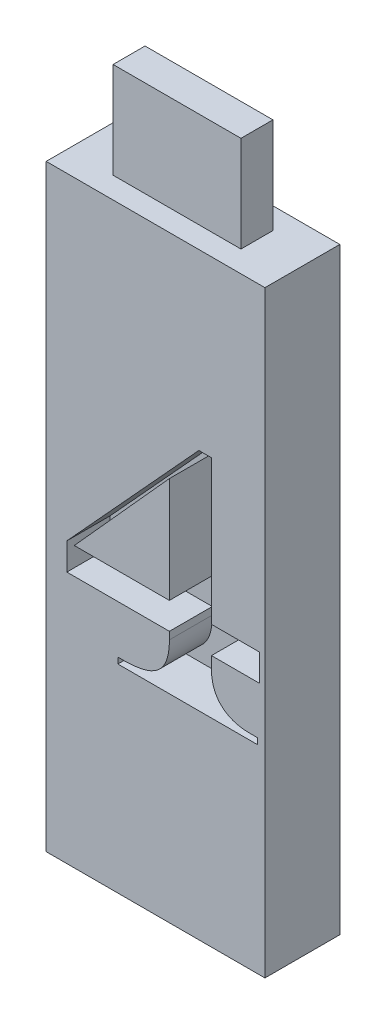
ISO-10303-21;
HEADER;
FILE_DESCRIPTION(('STEP AP214'),'2;1');
FILE_NAME('part.step','',(''),(''),'','','');
FILE_SCHEMA(('AUTOMOTIVE_DESIGN { 1 0 10303 214 1 1 1 1 }'));
ENDSEC;
DATA;
#1=APPLICATION_CONTEXT('core data for automotive mechanical design processes');
#2=APPLICATION_PROTOCOL_DEFINITION('international standard','automotive_design',2000,#1);
#3=PRODUCT_CONTEXT('',#1,'mechanical');
#4=PRODUCT('Part','Part','',(#3));
#5=PRODUCT_RELATED_PRODUCT_CATEGORY('part','',(#4));
#6=PRODUCT_DEFINITION_FORMATION('','',#4);
#7=PRODUCT_DEFINITION_CONTEXT('part definition',#1,'design');
#8=PRODUCT_DEFINITION('design','',#6,#7);
#9=PRODUCT_DEFINITION_SHAPE('','',#8);
#10=(LENGTH_UNIT() NAMED_UNIT(*) SI_UNIT(.MILLI.,.METRE.));
#11=(NAMED_UNIT(*) PLANE_ANGLE_UNIT() SI_UNIT($,.RADIAN.));
#12=(NAMED_UNIT(*) SI_UNIT($,.STERADIAN.) SOLID_ANGLE_UNIT());
#13=UNCERTAINTY_MEASURE_WITH_UNIT(LENGTH_MEASURE(1.E-05),#10,'distance_accuracy_value','');
#14=(GEOMETRIC_REPRESENTATION_CONTEXT(3) GLOBAL_UNCERTAINTY_ASSIGNED_CONTEXT((#13)) GLOBAL_UNIT_ASSIGNED_CONTEXT((#10,
#11,#12)) REPRESENTATION_CONTEXT('',''));
#15=CARTESIAN_POINT('',(0.,0.,0.));
#16=DIRECTION('',(0.,0.,1.));
#17=DIRECTION('',(1.,0.,0.));
#18=AXIS2_PLACEMENT_3D('',#15,#16,#17);
#19=CARTESIAN_POINT('',(-8.69,23.749,5.95));
#20=DIRECTION('',(0.,-1.,0.));
#21=DIRECTION('',(0.,0.,-1.));
#22=AXIS2_PLACEMENT_3D('',#19,#20,#21);
#23=PLANE('',#22);
#24=DIRECTION('',(-1.,0.,0.));
#25=VECTOR('',#24,1.);
#26=CARTESIAN_POINT('',(-8.69,23.749,0.));
#27=LINE('',#26,#25);
#28=CARTESIAN_POINT('',(8.69,23.749,0.));
#29=VERTEX_POINT('',#28);
#30=CARTESIAN_POINT('',(-8.69,23.749,0.));
#31=VERTEX_POINT('',#30);
#32=EDGE_CURVE('E380',#29,#31,#27,.T.);
#33=ORIENTED_EDGE('',*,*,#32,.T.);
#34=DIRECTION('',(0.,0.,-1.));
#35=VECTOR('',#34,1.);
#36=CARTESIAN_POINT('',(-8.69,23.749,5.95));
#37=LINE('',#36,#35);
#38=CARTESIAN_POINT('',(-8.69,23.749,5.95));
#39=VERTEX_POINT('',#38);
#40=EDGE_CURVE('E48',#39,#31,#37,.T.);
#41=ORIENTED_EDGE('',*,*,#40,.F.);
#42=DIRECTION('',(-1.,0.,0.));
#43=VECTOR('',#42,1.);
#44=CARTESIAN_POINT('',(-8.69,23.749,5.95));
#45=LINE('',#44,#43);
#46=CARTESIAN_POINT('',(8.69,23.749,5.95));
#47=VERTEX_POINT('',#46);
#48=EDGE_CURVE('E418',#47,#39,#45,.T.);
#49=ORIENTED_EDGE('',*,*,#48,.F.);
#50=DIRECTION('',(0.,0.,-1.));
#51=VECTOR('',#50,1.);
#52=CARTESIAN_POINT('',(8.69,23.749,5.95));
#53=LINE('',#52,#51);
#54=EDGE_CURVE('E11',#47,#29,#53,.T.);
#55=ORIENTED_EDGE('',*,*,#54,.T.);
#56=EDGE_LOOP('',(#33,#41,#49,#55));
#57=FACE_BOUND('',#56,.T.);
#58=DIRECTION('',(0.,0.,-1.));
#59=VECTOR('',#58,1.);
#60=CARTESIAN_POINT('',(5.08,23.749,4.245));
#61=LINE('',#60,#59);
#62=CARTESIAN_POINT('',(5.08,23.749,4.245));
#63=VERTEX_POINT('',#62);
#64=CARTESIAN_POINT('',(5.08,23.749,1.705));
#65=VERTEX_POINT('',#64);
#66=EDGE_CURVE('E55',#63,#65,#61,.T.);
#67=ORIENTED_EDGE('',*,*,#66,.F.);
#68=DIRECTION('',(1.,0.,0.));
#69=VECTOR('',#68,1.);
#70=CARTESIAN_POINT('',(-5.08,23.749,4.245));
#71=LINE('',#70,#69);
#72=CARTESIAN_POINT('',(-5.08,23.749,4.245));
#73=VERTEX_POINT('',#72);
#74=EDGE_CURVE('E59',#73,#63,#71,.T.);
#75=ORIENTED_EDGE('',*,*,#74,.F.);
#76=DIRECTION('',(0.,0.,1.));
#77=VECTOR('',#76,1.);
#78=CARTESIAN_POINT('',(-5.08,23.749,4.245));
#79=LINE('',#78,#77);
#80=CARTESIAN_POINT('',(-5.08,23.749,1.705));
#81=VERTEX_POINT('',#80);
#82=EDGE_CURVE('E907',#81,#73,#79,.T.);
#83=ORIENTED_EDGE('',*,*,#82,.F.);
#84=DIRECTION('',(-1.,0.,0.));
#85=VECTOR('',#84,1.);
#86=CARTESIAN_POINT('',(-5.08,23.749,1.705));
#87=LINE('',#86,#85);
#88=EDGE_CURVE('E917',#65,#81,#87,.T.);
#89=ORIENTED_EDGE('',*,*,#88,.F.);
#90=EDGE_LOOP('',(#67,#75,#83,#89));
#91=FACE_BOUND('',#90,.T.);
#92=ADVANCED_FACE('F39',(#57,#91),#23,.F.);
#93=CARTESIAN_POINT('',(0.,0.,5.95));
#94=DIRECTION('',(0.,0.,-1.));
#95=DIRECTION('',(-1.,0.,0.));
#96=AXIS2_PLACEMENT_3D('',#93,#94,#95);
#97=PLANE('',#96);
#98=DIRECTION('',(0.,1.,0.));
#99=VECTOR('',#98,1.);
#100=CARTESIAN_POINT('',(8.69,-23.749,5.95));
#101=LINE('',#100,#99);
#102=CARTESIAN_POINT('',(8.69,-23.749,5.95));
#103=VERTEX_POINT('',#102);
#104=EDGE_CURVE('E401',#103,#47,#101,.T.);
#105=ORIENTED_EDGE('',*,*,#104,.T.);
#106=ORIENTED_EDGE('',*,*,#48,.T.);
#107=DIRECTION('',(0.,-1.,0.));
#108=VECTOR('',#107,1.);
#109=CARTESIAN_POINT('',(-8.69,-23.749,5.95));
#110=LINE('',#109,#108);
#111=CARTESIAN_POINT('',(-8.69,-23.749,5.95));
#112=VERTEX_POINT('',#111);
#113=EDGE_CURVE('E393',#39,#112,#110,.T.);
#114=ORIENTED_EDGE('',*,*,#113,.T.);
#115=DIRECTION('',(1.,0.,0.));
#116=VECTOR('',#115,1.);
#117=CARTESIAN_POINT('',(-8.69,-23.749,5.95));
#118=LINE('',#117,#116);
#119=EDGE_CURVE('E409',#112,#103,#118,.T.);
#120=ORIENTED_EDGE('',*,*,#119,.T.);
#121=EDGE_LOOP('',(#105,#106,#114,#120));
#122=FACE_BOUND('',#121,.T.);
#123=DIRECTION('',(0.674941128782271,0.73787158278261,0.));
#124=VECTOR('',#123,1.);
#125=CARTESIAN_POINT('',(-7.04744218431016,-1.5393328511895,5.95));
#126=LINE('',#125,#124);
#127=CARTESIAN_POINT('',(-7.04744218431016,-1.5393328511895,5.95));
#128=VERTEX_POINT('',#127);
#129=CARTESIAN_POINT('',(3.43863994426617,9.92445515556726,5.95));
#130=VERTEX_POINT('',#129);
#131=EDGE_CURVE('E282',#128,#130,#126,.T.);
#132=ORIENTED_EDGE('',*,*,#131,.T.);
#133=DIRECTION('',(1.,0.,0.));
#134=VECTOR('',#133,1.);
#135=CARTESIAN_POINT('',(3.43863994426617,9.92445515556726,5.95));
#136=LINE('',#135,#134);
#137=CARTESIAN_POINT('',(4.44246773522241,9.92445515556726,5.95));
#138=VERTEX_POINT('',#137);
#139=EDGE_CURVE('E731',#130,#138,#136,.T.);
#140=ORIENTED_EDGE('',*,*,#139,.T.);
#141=DIRECTION('',(0.,-1.,0.));
#142=VECTOR('',#141,1.);
#143=CARTESIAN_POINT('',(4.44246773522241,9.92445515556726,5.95));
#144=LINE('',#143,#142);
#145=CARTESIAN_POINT('',(4.44246773522241,-1.5393328511895,5.95));
#146=VERTEX_POINT('',#145);
#147=EDGE_CURVE('E735',#138,#146,#144,.T.);
#148=ORIENTED_EDGE('',*,*,#147,.T.);
#149=DIRECTION('',(1.,0.,0.));
#150=VECTOR('',#149,1.);
#151=CARTESIAN_POINT('',(4.44246773522241,-1.5393328511895,5.95));
#152=LINE('',#151,#150);
#153=CARTESIAN_POINT('',(8.2562670004911,-1.5393328511895,5.95));
#154=VERTEX_POINT('',#153);
#155=EDGE_CURVE('E739',#146,#154,#152,.T.);
#156=ORIENTED_EDGE('',*,*,#155,.T.);
#157=DIRECTION('',(0.,-1.,0.));
#158=VECTOR('',#157,1.);
#159=CARTESIAN_POINT('',(8.2562670004911,-1.5393328511895,5.95));
#160=LINE('',#159,#158);
#161=CARTESIAN_POINT('',(8.2562670004911,-3.68879310245639,5.95));
#162=VERTEX_POINT('',#161);
#163=EDGE_CURVE('E743',#154,#162,#160,.T.);
#164=ORIENTED_EDGE('',*,*,#163,.T.);
#165=DIRECTION('',(-1.,0.,0.));
#166=VECTOR('',#165,1.);
#167=CARTESIAN_POINT('',(8.2562670004911,-3.68879310245639,5.95));
#168=LINE('',#167,#166);
#169=CARTESIAN_POINT('',(4.44246773522241,-3.68879310245639,5.95));
#170=VERTEX_POINT('',#169);
#171=EDGE_CURVE('E747',#162,#170,#168,.T.);
#172=ORIENTED_EDGE('',*,*,#171,.T.);
#173=DIRECTION('',(0.,-1.,0.));
#174=VECTOR('',#173,1.);
#175=CARTESIAN_POINT('',(4.44246773522241,-3.68879310245639,5.95));
#176=LINE('',#175,#174);
#177=CARTESIAN_POINT('',(4.44246773522241,-4.64037706786101,5.95));
#178=VERTEX_POINT('',#177);
#179=EDGE_CURVE('E751',#170,#178,#176,.T.);
#180=ORIENTED_EDGE('',*,*,#179,.T.);
#181=CARTESIAN_POINT('',(4.44246773522241,-4.64037706786101,5.95));
#182=CARTESIAN_POINT('',(4.44366975110086,-4.75127379866785,5.95));
#183=CARTESIAN_POINT('',(4.44601529045328,-4.96767081207351,5.95));
#184=CARTESIAN_POINT('',(4.49157384869356,-5.28006772864918,5.95));
#185=CARTESIAN_POINT('',(4.54742857293339,-5.57645144328253,5.95));
#186=CARTESIAN_POINT('',(4.63867937536125,-5.85058081596039,5.95));
#187=CARTESIAN_POINT('',(4.75028432598673,-6.10998885158692,5.95));
#188=CARTESIAN_POINT('',(4.89304534944383,-6.34555952869846,5.95));
#189=CARTESIAN_POINT('',(5.05424378576291,-6.56764848995591,5.95));
#190=CARTESIAN_POINT('',(5.24539935969311,-6.76411469066924,5.95));
#191=CARTESIAN_POINT('',(5.45895144040017,-6.93928061212406,5.95));
#192=CARTESIAN_POINT('',(5.69043798794372,-7.09416619456643,5.95));
#193=CARTESIAN_POINT('',(5.94412250974168,-7.21948208954657,5.95));
#194=CARTESIAN_POINT('',(6.21333093360488,-7.33042139895678,5.95));
#195=CARTESIAN_POINT('',(6.50533129087422,-7.41164301302733,5.95));
#196=CARTESIAN_POINT('',(6.81689616278627,-7.46473149438171,5.95));
#197=CARTESIAN_POINT('',(7.14565774333197,-7.50542750898047,5.95));
#198=CARTESIAN_POINT('',(7.37171724603748,-7.50848784223009,5.95));
#199=CARTESIAN_POINT('',(7.48753642451717,-7.51005577137531,5.95));
#200=B_SPLINE_CURVE_WITH_KNOTS('',3,(#181,#182,#183,#184,#185,#186,#187,#188,#189,#190,#191,
#192,#193,#194,#195,#196,#197,#198,#199),.UNSPECIFIED.,.F.,.F.,(4,1,1,1,1,1,1,1,1,1,1,1,1,1,1,1,
4),(0.,0.0699170360090995,0.136431774575017,0.198947754675914,0.26002731117954,
0.318381663113538,0.376820464226212,0.43350835233674,0.491257429411246,0.549262128880397,
0.607621762468199,0.666611761420359,0.727554917437324,0.791185073348929,0.857407233884197,
0.926944115018277,1.),.UNSPECIFIED.);
#201=CARTESIAN_POINT('',(7.48753642451717,-7.51005577137531,5.95));
#202=VERTEX_POINT('',#201);
#203=EDGE_CURVE('E755',#178,#202,#200,.T.);
#204=ORIENTED_EDGE('',*,*,#203,.T.);
#205=DIRECTION('',(1.,0.,0.));
#206=VECTOR('',#205,1.);
#207=CARTESIAN_POINT('',(7.48753642451717,-7.51005577137531,5.95));
#208=LINE('',#207,#206);
#209=CARTESIAN_POINT('',(8.08087701471064,-7.51005577137531,5.95));
#210=VERTEX_POINT('',#209);
#211=EDGE_CURVE('E761',#202,#210,#208,.T.);
#212=ORIENTED_EDGE('',*,*,#211,.T.);
#213=DIRECTION('',(0.,-1.,0.));
#214=VECTOR('',#213,1.);
#215=CARTESIAN_POINT('',(8.08087701471064,-7.51005577137531,5.95));
#216=LINE('',#215,#214);
#217=CARTESIAN_POINT('',(8.08087701471064,-7.98771360499018,5.95));
#218=VERTEX_POINT('',#217);
#219=EDGE_CURVE('E768',#210,#218,#216,.T.);
#220=ORIENTED_EDGE('',*,*,#219,.T.);
#221=DIRECTION('',(-1.,0.,0.));
#222=VECTOR('',#221,1.);
#223=CARTESIAN_POINT('',(8.08087701471064,-7.98771360499018,5.95));
#224=LINE('',#223,#222);
#225=CARTESIAN_POINT('',(-2.99481400223404,-7.98771360499018,5.95));
#226=VERTEX_POINT('',#225);
#227=EDGE_CURVE('E772',#218,#226,#224,.T.);
#228=ORIENTED_EDGE('',*,*,#227,.T.);
#229=DIRECTION('',(0.,1.,0.));
#230=VECTOR('',#229,1.);
#231=CARTESIAN_POINT('',(-2.99481400223404,-7.98771360499018,5.95));
#232=LINE('',#231,#230);
#233=CARTESIAN_POINT('',(-2.99481400223404,-7.51005577137531,5.95));
#234=VERTEX_POINT('',#233);
#235=EDGE_CURVE('E776',#226,#234,#232,.T.);
#236=ORIENTED_EDGE('',*,*,#235,.T.);
#237=DIRECTION('',(1.,0.,0.));
#238=VECTOR('',#237,1.);
#239=CARTESIAN_POINT('',(-2.99481400223404,-7.51005577137531,5.95));
#240=LINE('',#239,#238);
#241=CARTESIAN_POINT('',(-2.4537172375922,-7.51005577137531,5.95));
#242=VERTEX_POINT('',#241);
#243=EDGE_CURVE('E780',#234,#242,#240,.T.);
#244=ORIENTED_EDGE('',*,*,#243,.T.);
#245=CARTESIAN_POINT('',(-2.4537172375922,-7.51005577137531,5.95));
#246=CARTESIAN_POINT('',(-2.25823867435052,-7.50591168057794,5.95));
#247=CARTESIAN_POINT('',(-1.88482523440783,-7.49799542022477,5.95));
#248=CARTESIAN_POINT('',(-1.35131896545283,-7.43442233785716,5.95));
#249=CARTESIAN_POINT('',(-0.871964816685648,-7.3319439381712,5.95));
#250=CARTESIAN_POINT('',(-0.442786010743591,-7.18885028997265,5.95));
#251=CARTESIAN_POINT('',(-0.0689533016064384,-6.99156968457036,5.95));
#252=CARTESIAN_POINT('',(0.256975704342163,-6.75450130739875,5.95));
#253=CARTESIAN_POINT('',(0.523821338195153,-6.46213265309357,5.95));
#254=CARTESIAN_POINT('',(0.738539375180858,-6.12479811403825,5.95));
#255=CARTESIAN_POINT('',(0.904653386000662,-5.73672840445958,5.95));
#256=CARTESIAN_POINT('',(1.01620095687366,-5.29606749085615,5.95));
#257=CARTESIAN_POINT('',(1.08879249014675,-4.80448241414839,5.95));
#258=CARTESIAN_POINT('',(1.0954047982199,-4.45905398480305,5.95));
#259=CARTESIAN_POINT('',(1.09886289991836,-4.27840199082474,5.95));
#260=B_SPLINE_CURVE_WITH_KNOTS('',3,(#245,#246,#247,#248,#249,#250,#251,#252,#253,#254,#255,
#256,#257,#258,#259),.UNSPECIFIED.,.F.,.F.,(4,1,1,1,1,1,1,1,1,1,1,1,4),(0.,0.105562726738923,
0.201651476599896,0.289686176127068,0.37000366991305,0.445137561177256,0.517163983412064,
0.586586174477866,0.65759635562237,0.732232915493405,0.81355581343149,0.902493508906899,1.),.UNSPECIFIED.);
#261=CARTESIAN_POINT('',(1.09886289991836,-4.27840199082474,5.95));
#262=VERTEX_POINT('',#261);
#263=EDGE_CURVE('E784',#242,#262,#260,.T.);
#264=ORIENTED_EDGE('',*,*,#263,.T.);
#265=DIRECTION('',(0.,1.,0.));
#266=VECTOR('',#265,1.);
#267=CARTESIAN_POINT('',(1.09886289991836,-4.27840199082474,5.95));
#268=LINE('',#267,#266);
#269=CARTESIAN_POINT('',(1.09886289991836,-3.68879310245639,5.95));
#270=VERTEX_POINT('',#269);
#271=EDGE_CURVE('E790',#262,#270,#268,.T.);
#272=ORIENTED_EDGE('',*,*,#271,.T.);
#273=DIRECTION('',(-1.,0.,0.));
#274=VECTOR('',#273,1.);
#275=CARTESIAN_POINT('',(1.09886289991836,-3.68879310245639,5.95));
#276=LINE('',#275,#274);
#277=CARTESIAN_POINT('',(-7.04744218431016,-3.68879310245639,5.95));
#278=VERTEX_POINT('',#277);
#279=EDGE_CURVE('E797',#270,#278,#276,.T.);
#280=ORIENTED_EDGE('',*,*,#279,.T.);
#281=DIRECTION('',(0.,1.,0.));
#282=VECTOR('',#281,1.);
#283=CARTESIAN_POINT('',(-7.04744218431016,-3.68879310245639,5.95));
#284=LINE('',#283,#282);
#285=EDGE_CURVE('E294',#278,#128,#284,.T.);
#286=ORIENTED_EDGE('',*,*,#285,.T.);
#287=EDGE_LOOP('',(#132,#140,#148,#156,#164,#172,#180,#204,#212,#220,#228,#236,#244,#264,#272,
#280,#286));
#288=FACE_BOUND('',#287,.T.);
#289=ADVANCED_FACE('F360',(#122,#288),#97,.F.);
#290=CARTESIAN_POINT('',(8.69,-23.749,5.95));
#291=DIRECTION('',(-1.,0.,0.));
#292=DIRECTION('',(0.,0.,1.));
#293=AXIS2_PLACEMENT_3D('',#290,#291,#292);
#294=PLANE('',#293);
#295=DIRECTION('',(0.,1.,0.));
#296=VECTOR('',#295,1.);
#297=CARTESIAN_POINT('',(8.69,-23.749,0.));
#298=LINE('',#297,#296);
#299=CARTESIAN_POINT('',(8.69,-23.749,0.));
#300=VERTEX_POINT('',#299);
#301=EDGE_CURVE('E389',#300,#29,#298,.T.);
#302=ORIENTED_EDGE('',*,*,#301,.T.);
#303=ORIENTED_EDGE('',*,*,#54,.F.);
#304=ORIENTED_EDGE('',*,*,#104,.F.);
#305=DIRECTION('',(0.,0.,-1.));
#306=VECTOR('',#305,1.);
#307=CARTESIAN_POINT('',(8.69,-23.749,5.95));
#308=LINE('',#307,#306);
#309=EDGE_CURVE('E405',#103,#300,#308,.T.);
#310=ORIENTED_EDGE('',*,*,#309,.T.);
#311=EDGE_LOOP('',(#302,#303,#304,#310));
#312=FACE_BOUND('',#311,.T.);
#313=ADVANCED_FACE('F41',(#312),#294,.F.);
#314=CARTESIAN_POINT('',(-8.69,-23.749,5.95));
#315=DIRECTION('',(1.,0.,0.));
#316=DIRECTION('',(0.,0.,-1.));
#317=AXIS2_PLACEMENT_3D('',#314,#315,#316);
#318=PLANE('',#317);
#319=DIRECTION('',(0.,-1.,0.));
#320=VECTOR('',#319,1.);
#321=CARTESIAN_POINT('',(-8.69,-23.749,0.));
#322=LINE('',#321,#320);
#323=CARTESIAN_POINT('',(-8.69,-23.749,0.));
#324=VERTEX_POINT('',#323);
#325=EDGE_CURVE('E388',#31,#324,#322,.T.);
#326=ORIENTED_EDGE('',*,*,#325,.T.);
#327=DIRECTION('',(0.,0.,-1.));
#328=VECTOR('',#327,1.);
#329=CARTESIAN_POINT('',(-8.69,-23.749,5.95));
#330=LINE('',#329,#328);
#331=EDGE_CURVE('E395',#112,#324,#330,.T.);
#332=ORIENTED_EDGE('',*,*,#331,.F.);
#333=ORIENTED_EDGE('',*,*,#113,.F.);
#334=ORIENTED_EDGE('',*,*,#40,.T.);
#335=EDGE_LOOP('',(#326,#332,#333,#334));
#336=FACE_BOUND('',#335,.T.);
#337=ADVANCED_FACE('F371',(#336),#318,.F.);
#338=CARTESIAN_POINT('',(-8.69,-23.749,5.95));
#339=DIRECTION('',(0.,1.,0.));
#340=DIRECTION('',(0.,0.,1.));
#341=AXIS2_PLACEMENT_3D('',#338,#339,#340);
#342=PLANE('',#341);
#343=DIRECTION('',(1.,0.,0.));
#344=VECTOR('',#343,1.);
#345=CARTESIAN_POINT('',(-8.69,-23.749,0.));
#346=LINE('',#345,#344);
#347=EDGE_CURVE('E397',#324,#300,#346,.T.);
#348=ORIENTED_EDGE('',*,*,#347,.T.);
#349=ORIENTED_EDGE('',*,*,#309,.F.);
#350=ORIENTED_EDGE('',*,*,#119,.F.);
#351=ORIENTED_EDGE('',*,*,#331,.T.);
#352=EDGE_LOOP('',(#348,#349,#350,#351));
#353=FACE_BOUND('',#352,.T.);
#354=ADVANCED_FACE('F367',(#353),#342,.F.);
#355=CARTESIAN_POINT('',(0.,0.,0.));
#356=DIRECTION('',(0.,0.,-1.));
#357=DIRECTION('',(-1.,0.,0.));
#358=AXIS2_PLACEMENT_3D('',#355,#356,#357);
#359=PLANE('',#358);
#360=ORIENTED_EDGE('',*,*,#301,.F.);
#361=ORIENTED_EDGE('',*,*,#347,.F.);
#362=ORIENTED_EDGE('',*,*,#325,.F.);
#363=ORIENTED_EDGE('',*,*,#32,.F.);
#364=EDGE_LOOP('',(#360,#361,#362,#363));
#365=FACE_BOUND('',#364,.T.);
#366=ADVANCED_FACE('F358',(#365),#359,.T.);
#367=CARTESIAN_POINT('',(-7.04744218431016,-1.5393328511895,2.54));
#368=DIRECTION('',(0.73787158278261,-0.674941128782271,0.));
#369=DIRECTION('',(0.674941128782271,0.73787158278261,0.));
#370=AXIS2_PLACEMENT_3D('',#367,#368,#369);
#371=PLANE('',#370);
#372=ORIENTED_EDGE('',*,*,#131,.F.);
#373=DIRECTION('',(0.,0.,1.));
#374=VECTOR('',#373,1.);
#375=CARTESIAN_POINT('',(-7.04744218431016,-1.5393328511895,2.54));
#376=LINE('',#375,#374);
#377=CARTESIAN_POINT('',(-7.04744218431016,-1.5393328511895,2.54));
#378=VERTEX_POINT('',#377);
#379=EDGE_CURVE('E728',#378,#128,#376,.T.);
#380=ORIENTED_EDGE('',*,*,#379,.F.);
#381=DIRECTION('',(0.674941128782271,0.73787158278261,0.));
#382=VECTOR('',#381,1.);
#383=CARTESIAN_POINT('',(-7.04744218431016,-1.5393328511895,2.54));
#384=LINE('',#383,#382);
#385=CARTESIAN_POINT('',(3.43863994426617,9.92445515556726,2.54));
#386=VERTEX_POINT('',#385);
#387=EDGE_CURVE('E289',#378,#386,#384,.T.);
#388=ORIENTED_EDGE('',*,*,#387,.T.);
#389=DIRECTION('',(0.,0.,1.));
#390=VECTOR('',#389,1.);
#391=CARTESIAN_POINT('',(3.43863994426617,9.92445515556726,2.54));
#392=LINE('',#391,#390);
#393=EDGE_CURVE('E422',#386,#130,#392,.T.);
#394=ORIENTED_EDGE('',*,*,#393,.T.);
#395=EDGE_LOOP('',(#372,#380,#388,#394));
#396=FACE_BOUND('',#395,.T.);
#397=ADVANCED_FACE('F354',(#396),#371,.T.);
#398=CARTESIAN_POINT('',(3.43863994426617,9.92445515556726,2.54));
#399=DIRECTION('',(0.,-1.,0.));
#400=DIRECTION('',(0.,0.,-1.));
#401=AXIS2_PLACEMENT_3D('',#398,#399,#400);
#402=PLANE('',#401);
#403=ORIENTED_EDGE('',*,*,#139,.F.);
#404=ORIENTED_EDGE('',*,*,#393,.F.);
#405=DIRECTION('',(1.,0.,0.));
#406=VECTOR('',#405,1.);
#407=CARTESIAN_POINT('',(3.43863994426617,9.92445515556726,2.54));
#408=LINE('',#407,#406);
#409=CARTESIAN_POINT('',(4.44246773522241,9.92445515556726,2.54));
#410=VERTEX_POINT('',#409);
#411=EDGE_CURVE('E293',#386,#410,#408,.T.);
#412=ORIENTED_EDGE('',*,*,#411,.T.);
#413=DIRECTION('',(0.,0.,1.));
#414=VECTOR('',#413,1.);
#415=CARTESIAN_POINT('',(4.44246773522241,9.92445515556726,2.54));
#416=LINE('',#415,#414);
#417=EDGE_CURVE('E426',#410,#138,#416,.T.);
#418=ORIENTED_EDGE('',*,*,#417,.T.);
#419=EDGE_LOOP('',(#403,#404,#412,#418));
#420=FACE_BOUND('',#419,.T.);
#421=ADVANCED_FACE('F350',(#420),#402,.T.);
#422=CARTESIAN_POINT('',(4.44246773522241,9.92445515556726,2.54));
#423=DIRECTION('',(-1.,0.,0.));
#424=DIRECTION('',(0.,0.,1.));
#425=AXIS2_PLACEMENT_3D('',#422,#423,#424);
#426=PLANE('',#425);
#427=ORIENTED_EDGE('',*,*,#147,.F.);
#428=ORIENTED_EDGE('',*,*,#417,.F.);
#429=DIRECTION('',(0.,-1.,0.));
#430=VECTOR('',#429,1.);
#431=CARTESIAN_POINT('',(4.44246773522241,9.92445515556726,2.54));
#432=LINE('',#431,#430);
#433=CARTESIAN_POINT('',(4.44246773522241,-1.5393328511895,2.54));
#434=VERTEX_POINT('',#433);
#435=EDGE_CURVE('E297',#410,#434,#432,.T.);
#436=ORIENTED_EDGE('',*,*,#435,.T.);
#437=DIRECTION('',(0.,0.,1.));
#438=VECTOR('',#437,1.);
#439=CARTESIAN_POINT('',(4.44246773522241,-1.5393328511895,2.54));
#440=LINE('',#439,#438);
#441=EDGE_CURVE('E431',#434,#146,#440,.T.);
#442=ORIENTED_EDGE('',*,*,#441,.T.);
#443=EDGE_LOOP('',(#427,#428,#436,#442));
#444=FACE_BOUND('',#443,.T.);
#445=ADVANCED_FACE('F346',(#444),#426,.T.);
#446=CARTESIAN_POINT('',(4.44246773522241,-1.5393328511895,2.54));
#447=DIRECTION('',(0.,-1.,0.));
#448=DIRECTION('',(0.,0.,-1.));
#449=AXIS2_PLACEMENT_3D('',#446,#447,#448);
#450=PLANE('',#449);
#451=ORIENTED_EDGE('',*,*,#155,.F.);
#452=ORIENTED_EDGE('',*,*,#441,.F.);
#453=DIRECTION('',(1.,0.,0.));
#454=VECTOR('',#453,1.);
#455=CARTESIAN_POINT('',(4.44246773522241,-1.5393328511895,2.54));
#456=LINE('',#455,#454);
#457=CARTESIAN_POINT('',(8.2562670004911,-1.5393328511895,2.54));
#458=VERTEX_POINT('',#457);
#459=EDGE_CURVE('E300',#434,#458,#456,.T.);
#460=ORIENTED_EDGE('',*,*,#459,.T.);
#461=DIRECTION('',(0.,0.,1.));
#462=VECTOR('',#461,1.);
#463=CARTESIAN_POINT('',(8.2562670004911,-1.5393328511895,2.54));
#464=LINE('',#463,#462);
#465=EDGE_CURVE('E843',#458,#154,#464,.T.);
#466=ORIENTED_EDGE('',*,*,#465,.T.);
#467=EDGE_LOOP('',(#451,#452,#460,#466));
#468=FACE_BOUND('',#467,.T.);
#469=ADVANCED_FACE('F342',(#468),#450,.T.);
#470=CARTESIAN_POINT('',(8.2562670004911,-1.5393328511895,2.54));
#471=DIRECTION('',(-1.,0.,0.));
#472=DIRECTION('',(0.,0.,1.));
#473=AXIS2_PLACEMENT_3D('',#470,#471,#472);
#474=PLANE('',#473);
#475=ORIENTED_EDGE('',*,*,#163,.F.);
#476=ORIENTED_EDGE('',*,*,#465,.F.);
#477=DIRECTION('',(0.,-1.,0.));
#478=VECTOR('',#477,1.);
#479=CARTESIAN_POINT('',(8.2562670004911,-1.5393328511895,2.54));
#480=LINE('',#479,#478);
#481=CARTESIAN_POINT('',(8.2562670004911,-3.68879310245639,2.54));
#482=VERTEX_POINT('',#481);
#483=EDGE_CURVE('E303',#458,#482,#480,.T.);
#484=ORIENTED_EDGE('',*,*,#483,.T.);
#485=DIRECTION('',(0.,0.,1.));
#486=VECTOR('',#485,1.);
#487=CARTESIAN_POINT('',(8.2562670004911,-3.68879310245639,2.54));
#488=LINE('',#487,#486);
#489=EDGE_CURVE('E840',#482,#162,#488,.T.);
#490=ORIENTED_EDGE('',*,*,#489,.T.);
#491=EDGE_LOOP('',(#475,#476,#484,#490));
#492=FACE_BOUND('',#491,.T.);
#493=ADVANCED_FACE('F338',(#492),#474,.T.);
#494=CARTESIAN_POINT('',(8.2562670004911,-3.68879310245639,2.54));
#495=DIRECTION('',(0.,1.,0.));
#496=DIRECTION('',(0.,0.,1.));
#497=AXIS2_PLACEMENT_3D('',#494,#495,#496);
#498=PLANE('',#497);
#499=ORIENTED_EDGE('',*,*,#171,.F.);
#500=ORIENTED_EDGE('',*,*,#489,.F.);
#501=DIRECTION('',(-1.,0.,0.));
#502=VECTOR('',#501,1.);
#503=CARTESIAN_POINT('',(8.2562670004911,-3.68879310245639,2.54));
#504=LINE('',#503,#502);
#505=CARTESIAN_POINT('',(4.44246773522241,-3.68879310245639,2.54));
#506=VERTEX_POINT('',#505);
#507=EDGE_CURVE('E306',#482,#506,#504,.T.);
#508=ORIENTED_EDGE('',*,*,#507,.T.);
#509=DIRECTION('',(0.,0.,1.));
#510=VECTOR('',#509,1.);
#511=CARTESIAN_POINT('',(4.44246773522241,-3.68879310245639,2.54));
#512=LINE('',#511,#510);
#513=EDGE_CURVE('E837',#506,#170,#512,.T.);
#514=ORIENTED_EDGE('',*,*,#513,.T.);
#515=EDGE_LOOP('',(#499,#500,#508,#514));
#516=FACE_BOUND('',#515,.T.);
#517=ADVANCED_FACE('F334',(#516),#498,.T.);
#518=CARTESIAN_POINT('',(4.44246773522241,-3.68879310245639,2.54));
#519=DIRECTION('',(-1.,0.,0.));
#520=DIRECTION('',(0.,0.,1.));
#521=AXIS2_PLACEMENT_3D('',#518,#519,#520);
#522=PLANE('',#521);
#523=ORIENTED_EDGE('',*,*,#179,.F.);
#524=ORIENTED_EDGE('',*,*,#513,.F.);
#525=DIRECTION('',(0.,-1.,0.));
#526=VECTOR('',#525,1.);
#527=CARTESIAN_POINT('',(4.44246773522241,-3.68879310245639,2.54));
#528=LINE('',#527,#526);
#529=CARTESIAN_POINT('',(4.44246773522241,-4.64037706786101,2.54));
#530=VERTEX_POINT('',#529);
#531=EDGE_CURVE('E309',#506,#530,#528,.T.);
#532=ORIENTED_EDGE('',*,*,#531,.T.);
#533=DIRECTION('',(0.,0.,1.));
#534=VECTOR('',#533,1.);
#535=CARTESIAN_POINT('',(4.44246773522241,-4.64037706786101,2.54));
#536=LINE('',#535,#534);
#537=EDGE_CURVE('E834',#530,#178,#536,.T.);
#538=ORIENTED_EDGE('',*,*,#537,.T.);
#539=EDGE_LOOP('',(#523,#524,#532,#538));
#540=FACE_BOUND('',#539,.T.);
#541=ADVANCED_FACE('F329',(#540),#522,.T.);
#542=CARTESIAN_POINT('',(4.44246773522241,-4.64037706786101,2.54));
#543=CARTESIAN_POINT('',(4.44366975110086,-4.75127379866785,2.54));
#544=CARTESIAN_POINT('',(4.44601529045328,-4.96767081207351,2.54));
#545=CARTESIAN_POINT('',(4.49157384869356,-5.28006772864918,2.54));
#546=CARTESIAN_POINT('',(4.54742857293339,-5.57645144328253,2.54));
#547=CARTESIAN_POINT('',(4.63867937536125,-5.85058081596039,2.54));
#548=CARTESIAN_POINT('',(4.75028432598673,-6.10998885158692,2.54));
#549=CARTESIAN_POINT('',(4.89304534944383,-6.34555952869846,2.54));
#550=CARTESIAN_POINT('',(5.05424378576291,-6.56764848995591,2.54));
#551=CARTESIAN_POINT('',(5.24539935969311,-6.76411469066924,2.54));
#552=CARTESIAN_POINT('',(5.45895144040017,-6.93928061212406,2.54));
#553=CARTESIAN_POINT('',(5.69043798794372,-7.09416619456643,2.54));
#554=CARTESIAN_POINT('',(5.94412250974168,-7.21948208954657,2.54));
#555=CARTESIAN_POINT('',(6.21333093360488,-7.33042139895678,2.54));
#556=CARTESIAN_POINT('',(6.50533129087422,-7.41164301302733,2.54));
#557=CARTESIAN_POINT('',(6.81689616278627,-7.46473149438171,2.54));
#558=CARTESIAN_POINT('',(7.14565774333197,-7.50542750898047,2.54));
#559=CARTESIAN_POINT('',(7.37171724603748,-7.50848784223009,2.54));
#560=CARTESIAN_POINT('',(7.48753642451717,-7.51005577137531,2.54));
#561=B_SPLINE_CURVE_WITH_KNOTS('',3,(#542,#543,#544,#545,#546,#547,#548,#549,#550,#551,#552,
#553,#554,#555,#556,#557,#558,#559,#560),.UNSPECIFIED.,.F.,.F.,(4,1,1,1,1,1,1,1,1,1,1,1,1,1,1,1,
4),(0.,0.0699170360090995,0.136431774575017,0.198947754675914,0.26002731117954,
0.318381663113538,0.376820464226212,0.43350835233674,0.491257429411246,0.549262128880397,
0.607621762468199,0.666611761420359,0.727554917437324,0.791185073348929,0.857407233884197,
0.926944115018277,1.),.UNSPECIFIED.);
#562=DIRECTION('',(0.,0.,1.));
#563=VECTOR('',#562,1.);
#564=SURFACE_OF_LINEAR_EXTRUSION('',#561,#563);
#565=ORIENTED_EDGE('',*,*,#203,.F.);
#566=ORIENTED_EDGE('',*,*,#537,.F.);
#567=CARTESIAN_POINT('',(7.48753642451717,-7.51005577137531,2.54));
#568=VERTEX_POINT('',#567);
#569=EDGE_CURVE('E312',#530,#568,#561,.T.);
#570=ORIENTED_EDGE('',*,*,#569,.T.);
#571=DIRECTION('',(0.,0.,1.));
#572=VECTOR('',#571,1.);
#573=CARTESIAN_POINT('',(7.48753642451717,-7.51005577137531,2.54));
#574=LINE('',#573,#572);
#575=EDGE_CURVE('E831',#568,#202,#574,.T.);
#576=ORIENTED_EDGE('',*,*,#575,.T.);
#577=EDGE_LOOP('',(#565,#566,#570,#576));
#578=FACE_BOUND('',#577,.T.);
#579=ADVANCED_FACE('F324',(#578),#564,.T.);
#580=CARTESIAN_POINT('',(7.48753642451717,-7.51005577137531,2.54));
#581=DIRECTION('',(0.,-1.,0.));
#582=DIRECTION('',(0.,0.,-1.));
#583=AXIS2_PLACEMENT_3D('',#580,#581,#582);
#584=PLANE('',#583);
#585=ORIENTED_EDGE('',*,*,#211,.F.);
#586=ORIENTED_EDGE('',*,*,#575,.F.);
#587=DIRECTION('',(1.,0.,0.));
#588=VECTOR('',#587,1.);
#589=CARTESIAN_POINT('',(7.48753642451717,-7.51005577137531,2.54));
#590=LINE('',#589,#588);
#591=CARTESIAN_POINT('',(8.08087701471064,-7.51005577137531,2.54));
#592=VERTEX_POINT('',#591);
#593=EDGE_CURVE('E318',#568,#592,#590,.T.);
#594=ORIENTED_EDGE('',*,*,#593,.T.);
#595=DIRECTION('',(0.,0.,1.));
#596=VECTOR('',#595,1.);
#597=CARTESIAN_POINT('',(8.08087701471064,-7.51005577137531,2.54));
#598=LINE('',#597,#596);
#599=EDGE_CURVE('E828',#592,#210,#598,.T.);
#600=ORIENTED_EDGE('',*,*,#599,.T.);
#601=EDGE_LOOP('',(#585,#586,#594,#600));
#602=FACE_BOUND('',#601,.T.);
#603=ADVANCED_FACE('F328',(#602),#584,.T.);
#604=CARTESIAN_POINT('',(8.08087701471064,-7.51005577137531,2.54));
#605=DIRECTION('',(-1.,0.,0.));
#606=DIRECTION('',(0.,0.,1.));
#607=AXIS2_PLACEMENT_3D('',#604,#605,#606);
#608=PLANE('',#607);
#609=ORIENTED_EDGE('',*,*,#219,.F.);
#610=ORIENTED_EDGE('',*,*,#599,.F.);
#611=DIRECTION('',(0.,-1.,0.));
#612=VECTOR('',#611,1.);
#613=CARTESIAN_POINT('',(8.08087701471064,-7.51005577137531,2.54));
#614=LINE('',#613,#612);
#615=CARTESIAN_POINT('',(8.08087701471064,-7.98771360499018,2.54));
#616=VERTEX_POINT('',#615);
#617=EDGE_CURVE('E874',#592,#616,#614,.T.);
#618=ORIENTED_EDGE('',*,*,#617,.T.);
#619=DIRECTION('',(0.,0.,1.));
#620=VECTOR('',#619,1.);
#621=CARTESIAN_POINT('',(8.08087701471064,-7.98771360499018,2.54));
#622=LINE('',#621,#620);
#623=EDGE_CURVE('E825',#616,#218,#622,.T.);
#624=ORIENTED_EDGE('',*,*,#623,.T.);
#625=EDGE_LOOP('',(#609,#610,#618,#624));
#626=FACE_BOUND('',#625,.T.);
#627=ADVANCED_FACE('F493',(#626),#608,.T.);
#628=CARTESIAN_POINT('',(8.08087701471064,-7.98771360499018,2.54));
#629=DIRECTION('',(0.,1.,0.));
#630=DIRECTION('',(0.,0.,1.));
#631=AXIS2_PLACEMENT_3D('',#628,#629,#630);
#632=PLANE('',#631);
#633=ORIENTED_EDGE('',*,*,#227,.F.);
#634=ORIENTED_EDGE('',*,*,#623,.F.);
#635=DIRECTION('',(-1.,0.,0.));
#636=VECTOR('',#635,1.);
#637=CARTESIAN_POINT('',(8.08087701471064,-7.98771360499018,2.54));
#638=LINE('',#637,#636);
#639=CARTESIAN_POINT('',(-2.99481400223404,-7.98771360499018,2.54));
#640=VERTEX_POINT('',#639);
#641=EDGE_CURVE('E898',#616,#640,#638,.T.);
#642=ORIENTED_EDGE('',*,*,#641,.T.);
#643=DIRECTION('',(0.,0.,1.));
#644=VECTOR('',#643,1.);
#645=CARTESIAN_POINT('',(-2.99481400223404,-7.98771360499018,2.54));
#646=LINE('',#645,#644);
#647=EDGE_CURVE('E822',#640,#226,#646,.T.);
#648=ORIENTED_EDGE('',*,*,#647,.T.);
#649=EDGE_LOOP('',(#633,#634,#642,#648));
#650=FACE_BOUND('',#649,.T.);
#651=ADVANCED_FACE('F500',(#650),#632,.T.);
#652=CARTESIAN_POINT('',(-2.99481400223404,-7.98771360499018,2.54));
#653=DIRECTION('',(1.,0.,0.));
#654=DIRECTION('',(0.,0.,-1.));
#655=AXIS2_PLACEMENT_3D('',#652,#653,#654);
#656=PLANE('',#655);
#657=ORIENTED_EDGE('',*,*,#235,.F.);
#658=ORIENTED_EDGE('',*,*,#647,.F.);
#659=DIRECTION('',(0.,1.,0.));
#660=VECTOR('',#659,1.);
#661=CARTESIAN_POINT('',(-2.99481400223404,-7.98771360499018,2.54));
#662=LINE('',#661,#660);
#663=CARTESIAN_POINT('',(-2.99481400223404,-7.51005577137531,2.54));
#664=VERTEX_POINT('',#663);
#665=EDGE_CURVE('E881',#640,#664,#662,.T.);
#666=ORIENTED_EDGE('',*,*,#665,.T.);
#667=DIRECTION('',(0.,0.,1.));
#668=VECTOR('',#667,1.);
#669=CARTESIAN_POINT('',(-2.99481400223404,-7.51005577137531,2.54));
#670=LINE('',#669,#668);
#671=EDGE_CURVE('E819',#664,#234,#670,.T.);
#672=ORIENTED_EDGE('',*,*,#671,.T.);
#673=EDGE_LOOP('',(#657,#658,#666,#672));
#674=FACE_BOUND('',#673,.T.);
#675=ADVANCED_FACE('F507',(#674),#656,.T.);
#676=CARTESIAN_POINT('',(-2.99481400223404,-7.51005577137531,2.54));
#677=DIRECTION('',(0.,-1.,0.));
#678=DIRECTION('',(0.,0.,-1.));
#679=AXIS2_PLACEMENT_3D('',#676,#677,#678);
#680=PLANE('',#679);
#681=ORIENTED_EDGE('',*,*,#243,.F.);
#682=ORIENTED_EDGE('',*,*,#671,.F.);
#683=DIRECTION('',(1.,0.,0.));
#684=VECTOR('',#683,1.);
#685=CARTESIAN_POINT('',(-2.99481400223404,-7.51005577137531,2.54));
#686=LINE('',#685,#684);
#687=CARTESIAN_POINT('',(-2.4537172375922,-7.51005577137531,2.54));
#688=VERTEX_POINT('',#687);
#689=EDGE_CURVE('E715',#664,#688,#686,.T.);
#690=ORIENTED_EDGE('',*,*,#689,.T.);
#691=DIRECTION('',(0.,0.,1.));
#692=VECTOR('',#691,1.);
#693=CARTESIAN_POINT('',(-2.4537172375922,-7.51005577137531,2.54));
#694=LINE('',#693,#692);
#695=EDGE_CURVE('E816',#688,#242,#694,.T.);
#696=ORIENTED_EDGE('',*,*,#695,.T.);
#697=EDGE_LOOP('',(#681,#682,#690,#696));
#698=FACE_BOUND('',#697,.T.);
#699=ADVANCED_FACE('F515',(#698),#680,.T.);
#700=CARTESIAN_POINT('',(-2.4537172375922,-7.51005577137531,2.54));
#701=CARTESIAN_POINT('',(-2.25823867435052,-7.50591168057794,2.54));
#702=CARTESIAN_POINT('',(-1.88482523440783,-7.49799542022477,2.54));
#703=CARTESIAN_POINT('',(-1.35131896545283,-7.43442233785716,2.54));
#704=CARTESIAN_POINT('',(-0.871964816685648,-7.3319439381712,2.54));
#705=CARTESIAN_POINT('',(-0.442786010743591,-7.18885028997265,2.54));
#706=CARTESIAN_POINT('',(-0.0689533016064384,-6.99156968457036,2.54));
#707=CARTESIAN_POINT('',(0.256975704342163,-6.75450130739875,2.54));
#708=CARTESIAN_POINT('',(0.523821338195153,-6.46213265309357,2.54));
#709=CARTESIAN_POINT('',(0.738539375180858,-6.12479811403825,2.54));
#710=CARTESIAN_POINT('',(0.904653386000662,-5.73672840445958,2.54));
#711=CARTESIAN_POINT('',(1.01620095687366,-5.29606749085615,2.54));
#712=CARTESIAN_POINT('',(1.08879249014675,-4.80448241414839,2.54));
#713=CARTESIAN_POINT('',(1.0954047982199,-4.45905398480305,2.54));
#714=CARTESIAN_POINT('',(1.09886289991836,-4.27840199082474,2.54));
#715=B_SPLINE_CURVE_WITH_KNOTS('',3,(#700,#701,#702,#703,#704,#705,#706,#707,#708,#709,#710,
#711,#712,#713,#714),.UNSPECIFIED.,.F.,.F.,(4,1,1,1,1,1,1,1,1,1,1,1,4),(0.,0.105562726738923,
0.201651476599896,0.289686176127068,0.37000366991305,0.445137561177256,0.517163983412064,
0.586586174477866,0.65759635562237,0.732232915493405,0.81355581343149,0.902493508906899,1.),.UNSPECIFIED.);
#716=DIRECTION('',(0.,0.,1.));
#717=VECTOR('',#716,1.);
#718=SURFACE_OF_LINEAR_EXTRUSION('',#715,#717);
#719=ORIENTED_EDGE('',*,*,#263,.F.);
#720=ORIENTED_EDGE('',*,*,#695,.F.);
#721=CARTESIAN_POINT('',(1.09886289991836,-4.27840199082474,2.54));
#722=VERTEX_POINT('',#721);
#723=EDGE_CURVE('E707',#688,#722,#715,.T.);
#724=ORIENTED_EDGE('',*,*,#723,.T.);
#725=DIRECTION('',(0.,0.,1.));
#726=VECTOR('',#725,1.);
#727=CARTESIAN_POINT('',(1.09886289991836,-4.27840199082474,2.54));
#728=LINE('',#727,#726);
#729=EDGE_CURVE('E813',#722,#262,#728,.T.);
#730=ORIENTED_EDGE('',*,*,#729,.T.);
#731=EDGE_LOOP('',(#719,#720,#724,#730));
#732=FACE_BOUND('',#731,.T.);
#733=ADVANCED_FACE('F523',(#732),#718,.T.);
#734=CARTESIAN_POINT('',(1.09886289991836,-4.27840199082474,2.54));
#735=DIRECTION('',(1.,0.,0.));
#736=DIRECTION('',(0.,0.,-1.));
#737=AXIS2_PLACEMENT_3D('',#734,#735,#736);
#738=PLANE('',#737);
#739=ORIENTED_EDGE('',*,*,#271,.F.);
#740=ORIENTED_EDGE('',*,*,#729,.F.);
#741=DIRECTION('',(0.,1.,0.));
#742=VECTOR('',#741,1.);
#743=CARTESIAN_POINT('',(1.09886289991836,-4.27840199082474,2.54));
#744=LINE('',#743,#742);
#745=CARTESIAN_POINT('',(1.09886289991836,-3.68879310245639,2.54));
#746=VERTEX_POINT('',#745);
#747=EDGE_CURVE('E714',#722,#746,#744,.T.);
#748=ORIENTED_EDGE('',*,*,#747,.T.);
#749=DIRECTION('',(0.,0.,1.));
#750=VECTOR('',#749,1.);
#751=CARTESIAN_POINT('',(1.09886289991836,-3.68879310245639,2.54));
#752=LINE('',#751,#750);
#753=EDGE_CURVE('E810',#746,#270,#752,.T.);
#754=ORIENTED_EDGE('',*,*,#753,.T.);
#755=EDGE_LOOP('',(#739,#740,#748,#754));
#756=FACE_BOUND('',#755,.T.);
#757=ADVANCED_FACE('F531',(#756),#738,.T.);
#758=CARTESIAN_POINT('',(1.09886289991836,-3.68879310245639,2.54));
#759=DIRECTION('',(0.,1.,0.));
#760=DIRECTION('',(0.,0.,1.));
#761=AXIS2_PLACEMENT_3D('',#758,#759,#760);
#762=PLANE('',#761);
#763=ORIENTED_EDGE('',*,*,#279,.F.);
#764=ORIENTED_EDGE('',*,*,#753,.F.);
#765=DIRECTION('',(-1.,0.,0.));
#766=VECTOR('',#765,1.);
#767=CARTESIAN_POINT('',(1.09886289991836,-3.68879310245639,2.54));
#768=LINE('',#767,#766);
#769=CARTESIAN_POINT('',(-7.04744218431016,-3.68879310245639,2.54));
#770=VERTEX_POINT('',#769);
#771=EDGE_CURVE('E722',#746,#770,#768,.T.);
#772=ORIENTED_EDGE('',*,*,#771,.T.);
#773=DIRECTION('',(0.,0.,1.));
#774=VECTOR('',#773,1.);
#775=CARTESIAN_POINT('',(-7.04744218431016,-3.68879310245639,2.54));
#776=LINE('',#775,#774);
#777=EDGE_CURVE('E807',#770,#278,#776,.T.);
#778=ORIENTED_EDGE('',*,*,#777,.T.);
#779=EDGE_LOOP('',(#763,#764,#772,#778));
#780=FACE_BOUND('',#779,.T.);
#781=ADVANCED_FACE('F539',(#780),#762,.T.);
#782=CARTESIAN_POINT('',(-7.04744218431016,-3.68879310245639,2.54));
#783=DIRECTION('',(1.,0.,0.));
#784=DIRECTION('',(0.,0.,-1.));
#785=AXIS2_PLACEMENT_3D('',#782,#783,#784);
#786=PLANE('',#785);
#787=ORIENTED_EDGE('',*,*,#285,.F.);
#788=ORIENTED_EDGE('',*,*,#777,.F.);
#789=DIRECTION('',(0.,1.,0.));
#790=VECTOR('',#789,1.);
#791=CARTESIAN_POINT('',(-7.04744218431016,-3.68879310245639,2.54));
#792=LINE('',#791,#790);
#793=EDGE_CURVE('E725',#770,#378,#792,.T.);
#794=ORIENTED_EDGE('',*,*,#793,.T.);
#795=ORIENTED_EDGE('',*,*,#379,.T.);
#796=EDGE_LOOP('',(#787,#788,#794,#795));
#797=FACE_BOUND('',#796,.T.);
#798=ADVANCED_FACE('F547',(#797),#786,.T.);
#799=CARTESIAN_POINT('',(5.27936446621403,-6.78785867253945,2.54));
#800=DIRECTION('',(0.,0.,-1.));
#801=DIRECTION('',(-1.,0.,0.));
#802=AXIS2_PLACEMENT_3D('',#799,#800,#801);
#803=PLANE('',#802);
#804=DIRECTION('',(0.,1.,0.));
#805=VECTOR('',#804,1.);
#806=CARTESIAN_POINT('',(1.09886289991836,-1.56545476396531,2.54));
#807=LINE('',#806,#805);
#808=CARTESIAN_POINT('',(1.09886289991836,-1.56545476396531,2.54));
#809=VERTEX_POINT('',#808);
#810=CARTESIAN_POINT('',(1.09886289991836,6.81967923707064,2.54));
#811=VERTEX_POINT('',#810);
#812=EDGE_CURVE('E259',#809,#811,#807,.T.);
#813=ORIENTED_EDGE('',*,*,#812,.F.);
#814=DIRECTION('',(1.,0.,0.));
#815=VECTOR('',#814,1.);
#816=CARTESIAN_POINT('',(-6.45783329594181,-1.56545476396531,2.54));
#817=LINE('',#816,#815);
#818=CARTESIAN_POINT('',(-6.45783329594181,-1.56545476396531,2.5399999999989));
#819=VERTEX_POINT('',#818);
#820=EDGE_CURVE('E268',#819,#809,#817,.T.);
#821=ORIENTED_EDGE('',*,*,#820,.F.);
#822=DIRECTION('',(-0.669457739257307,-0.742850143264774,0.));
#823=VECTOR('',#822,1.);
#824=CARTESIAN_POINT('',(1.09886289991836,6.81967923707064,2.54));
#825=LINE('',#824,#823);
#826=EDGE_CURVE('E263',#811,#819,#825,.T.);
#827=ORIENTED_EDGE('',*,*,#826,.F.);
#828=EDGE_LOOP('',(#813,#821,#827));
#829=FACE_BOUND('',#828,.T.);
#830=ORIENTED_EDGE('',*,*,#387,.F.);
#831=ORIENTED_EDGE('',*,*,#793,.F.);
#832=ORIENTED_EDGE('',*,*,#771,.F.);
#833=ORIENTED_EDGE('',*,*,#747,.F.);
#834=ORIENTED_EDGE('',*,*,#723,.F.);
#835=ORIENTED_EDGE('',*,*,#689,.F.);
#836=ORIENTED_EDGE('',*,*,#665,.F.);
#837=ORIENTED_EDGE('',*,*,#641,.F.);
#838=ORIENTED_EDGE('',*,*,#617,.F.);
#839=ORIENTED_EDGE('',*,*,#593,.F.);
#840=ORIENTED_EDGE('',*,*,#569,.F.);
#841=ORIENTED_EDGE('',*,*,#531,.F.);
#842=ORIENTED_EDGE('',*,*,#507,.F.);
#843=ORIENTED_EDGE('',*,*,#483,.F.);
#844=ORIENTED_EDGE('',*,*,#459,.F.);
#845=ORIENTED_EDGE('',*,*,#435,.F.);
#846=ORIENTED_EDGE('',*,*,#411,.F.);
#847=EDGE_LOOP('',(#830,#831,#832,#833,#834,#835,#836,#837,#838,#839,#840,#841,#842,#843,#844,
#845,#846));
#848=FACE_BOUND('',#847,.T.);
#849=ADVANCED_FACE('F555',(#829,#848),#803,.F.);
#850=CARTESIAN_POINT('',(1.09886289991836,-1.56545476396531,2.54));
#851=DIRECTION('',(1.,0.,0.));
#852=DIRECTION('',(0.,0.,-1.));
#853=AXIS2_PLACEMENT_3D('',#850,#851,#852);
#854=PLANE('',#853);
#855=DIRECTION('',(0.,1.,0.));
#856=VECTOR('',#855,1.);
#857=CARTESIAN_POINT('',(1.09886289991836,-1.56545476396531,5.95));
#858=LINE('',#857,#856);
#859=CARTESIAN_POINT('',(1.09886289991836,-1.56545476396531,5.95));
#860=VERTEX_POINT('',#859);
#861=CARTESIAN_POINT('',(1.09886289991836,6.81967923707063,5.94999999999971));
#862=VERTEX_POINT('',#861);
#863=EDGE_CURVE('E248',#860,#862,#858,.T.);
#864=ORIENTED_EDGE('',*,*,#863,.F.);
#865=DIRECTION('',(0.,0.,1.));
#866=VECTOR('',#865,1.);
#867=CARTESIAN_POINT('',(1.09886289991836,-1.56545476396531,2.54));
#868=LINE('',#867,#866);
#869=EDGE_CURVE('E279',#809,#860,#868,.T.);
#870=ORIENTED_EDGE('',*,*,#869,.F.);
#871=ORIENTED_EDGE('',*,*,#812,.T.);
#872=DIRECTION('',(0.,0.,1.));
#873=VECTOR('',#872,1.);
#874=CARTESIAN_POINT('',(1.09886289991836,6.81967923707064,2.54));
#875=LINE('',#874,#873);
#876=EDGE_CURVE('E271',#811,#862,#875,.T.);
#877=ORIENTED_EDGE('',*,*,#876,.T.);
#878=EDGE_LOOP('',(#864,#870,#871,#877));
#879=FACE_BOUND('',#878,.T.);
#880=ADVANCED_FACE('F563',(#879),#854,.T.);
#881=CARTESIAN_POINT('',(-6.45783329594181,-1.56545476396531,2.54));
#882=DIRECTION('',(0.,-1.,0.));
#883=DIRECTION('',(0.,0.,-1.));
#884=AXIS2_PLACEMENT_3D('',#881,#882,#883);
#885=PLANE('',#884);
#886=DIRECTION('',(1.,0.,0.));
#887=VECTOR('',#886,1.);
#888=CARTESIAN_POINT('',(-6.45783329594181,-1.56545476396531,5.95));
#889=LINE('',#888,#887);
#890=CARTESIAN_POINT('',(-6.45783329594181,-1.56545476396531,5.95));
#891=VERTEX_POINT('',#890);
#892=EDGE_CURVE('E264',#891,#860,#889,.T.);
#893=ORIENTED_EDGE('',*,*,#892,.F.);
#894=DIRECTION('',(0.,0.,1.));
#895=VECTOR('',#894,1.);
#896=CARTESIAN_POINT('',(-6.45783329594181,-1.56545476396531,2.54));
#897=LINE('',#896,#895);
#898=EDGE_CURVE('E283',#819,#891,#897,.T.);
#899=ORIENTED_EDGE('',*,*,#898,.F.);
#900=ORIENTED_EDGE('',*,*,#820,.T.);
#901=ORIENTED_EDGE('',*,*,#869,.T.);
#902=EDGE_LOOP('',(#893,#899,#900,#901));
#903=FACE_BOUND('',#902,.T.);
#904=ADVANCED_FACE('F571',(#903),#885,.T.);
#905=CARTESIAN_POINT('',(1.09886289991836,6.81967923707064,2.54));
#906=DIRECTION('',(-0.742850143264774,0.669457739257307,0.));
#907=DIRECTION('',(-0.669457739257307,-0.742850143264774,0.));
#908=AXIS2_PLACEMENT_3D('',#905,#906,#907);
#909=PLANE('',#908);
#910=DIRECTION('',(-0.669457739257307,-0.742850143264774,0.));
#911=VECTOR('',#910,1.);
#912=CARTESIAN_POINT('',(1.09886289991836,6.81967923707064,5.95));
#913=LINE('',#912,#911);
#914=EDGE_CURVE('E253',#862,#891,#913,.T.);
#915=ORIENTED_EDGE('',*,*,#914,.F.);
#916=ORIENTED_EDGE('',*,*,#876,.F.);
#917=ORIENTED_EDGE('',*,*,#826,.T.);
#918=ORIENTED_EDGE('',*,*,#898,.T.);
#919=EDGE_LOOP('',(#915,#916,#917,#918));
#920=FACE_BOUND('',#919,.T.);
#921=ADVANCED_FACE('F579',(#920),#909,.T.);
#922=ORIENTED_EDGE('',*,*,#863,.T.);
#923=ORIENTED_EDGE('',*,*,#914,.T.);
#924=ORIENTED_EDGE('',*,*,#892,.T.);
#925=EDGE_LOOP('',(#922,#923,#924));
#926=FACE_BOUND('',#925,.T.);
#927=ADVANCED_FACE('F364',(#926),#97,.F.);
#928=CARTESIAN_POINT('',(5.08,31.369,4.245));
#929=DIRECTION('',(-1.,0.,0.));
#930=DIRECTION('',(0.,0.,1.));
#931=AXIS2_PLACEMENT_3D('',#928,#929,#930);
#932=PLANE('',#931);
#933=ORIENTED_EDGE('',*,*,#66,.T.);
#934=DIRECTION('',(0.,-1.,0.));
#935=VECTOR('',#934,1.);
#936=CARTESIAN_POINT('',(5.08,31.369,1.705));
#937=LINE('',#936,#935);
#938=CARTESIAN_POINT('',(5.08,31.369,1.705));
#939=VERTEX_POINT('',#938);
#940=EDGE_CURVE('E228',#939,#65,#937,.T.);
#941=ORIENTED_EDGE('',*,*,#940,.F.);
#942=DIRECTION('',(0.,0.,-1.));
#943=VECTOR('',#942,1.);
#944=CARTESIAN_POINT('',(5.08,31.369,4.245));
#945=LINE('',#944,#943);
#946=CARTESIAN_POINT('',(5.08,31.369,4.245));
#947=VERTEX_POINT('',#946);
#948=EDGE_CURVE('E235',#947,#939,#945,.T.);
#949=ORIENTED_EDGE('',*,*,#948,.F.);
#950=DIRECTION('',(0.,-1.,0.));
#951=VECTOR('',#950,1.);
#952=CARTESIAN_POINT('',(5.08,31.369,4.245));
#953=LINE('',#952,#951);
#954=EDGE_CURVE('E904',#947,#63,#953,.T.);
#955=ORIENTED_EDGE('',*,*,#954,.T.);
#956=EDGE_LOOP('',(#933,#941,#949,#955));
#957=FACE_BOUND('',#956,.T.);
#958=ADVANCED_FACE('F246',(#957),#932,.F.);
#959=CARTESIAN_POINT('',(-5.08,31.369,1.705));
#960=DIRECTION('',(0.,0.,1.));
#961=DIRECTION('',(1.,0.,0.));
#962=AXIS2_PLACEMENT_3D('',#959,#960,#961);
#963=PLANE('',#962);
#964=ORIENTED_EDGE('',*,*,#88,.T.);
#965=DIRECTION('',(0.,-1.,0.));
#966=VECTOR('',#965,1.);
#967=CARTESIAN_POINT('',(-5.08,31.369,1.705));
#968=LINE('',#967,#966);
#969=CARTESIAN_POINT('',(-5.08,31.369,1.705));
#970=VERTEX_POINT('',#969);
#971=EDGE_CURVE('E230',#970,#81,#968,.T.);
#972=ORIENTED_EDGE('',*,*,#971,.F.);
#973=DIRECTION('',(-1.,0.,0.));
#974=VECTOR('',#973,1.);
#975=CARTESIAN_POINT('',(-5.08,31.369,1.705));
#976=LINE('',#975,#974);
#977=EDGE_CURVE('E223',#939,#970,#976,.T.);
#978=ORIENTED_EDGE('',*,*,#977,.F.);
#979=ORIENTED_EDGE('',*,*,#940,.T.);
#980=EDGE_LOOP('',(#964,#972,#978,#979));
#981=FACE_BOUND('',#980,.T.);
#982=ADVANCED_FACE('F226',(#981),#963,.F.);
#983=CARTESIAN_POINT('',(-5.08,31.369,4.245));
#984=DIRECTION('',(1.,0.,0.));
#985=DIRECTION('',(0.,0.,-1.));
#986=AXIS2_PLACEMENT_3D('',#983,#984,#985);
#987=PLANE('',#986);
#988=ORIENTED_EDGE('',*,*,#82,.T.);
#989=DIRECTION('',(0.,-1.,0.));
#990=VECTOR('',#989,1.);
#991=CARTESIAN_POINT('',(-5.08,31.369,4.245));
#992=LINE('',#991,#990);
#993=CARTESIAN_POINT('',(-5.08,31.369,4.245));
#994=VERTEX_POINT('',#993);
#995=EDGE_CURVE('E255',#994,#73,#992,.T.);
#996=ORIENTED_EDGE('',*,*,#995,.F.);
#997=DIRECTION('',(0.,0.,1.));
#998=VECTOR('',#997,1.);
#999=CARTESIAN_POINT('',(-5.08,31.369,4.245));
#1000=LINE('',#999,#998);
#1001=EDGE_CURVE('E234',#970,#994,#1000,.T.);
#1002=ORIENTED_EDGE('',*,*,#1001,.F.);
#1003=ORIENTED_EDGE('',*,*,#971,.T.);
#1004=EDGE_LOOP('',(#988,#996,#1002,#1003));
#1005=FACE_BOUND('',#1004,.T.);
#1006=ADVANCED_FACE('F606',(#1005),#987,.F.);
#1007=CARTESIAN_POINT('',(-5.08,31.369,4.245));
#1008=DIRECTION('',(0.,0.,-1.));
#1009=DIRECTION('',(-1.,0.,0.));
#1010=AXIS2_PLACEMENT_3D('',#1007,#1008,#1009);
#1011=PLANE('',#1010);
#1012=ORIENTED_EDGE('',*,*,#74,.T.);
#1013=ORIENTED_EDGE('',*,*,#954,.F.);
#1014=DIRECTION('',(1.,0.,0.));
#1015=VECTOR('',#1014,1.);
#1016=CARTESIAN_POINT('',(-5.08,31.369,4.245));
#1017=LINE('',#1016,#1015);
#1018=EDGE_CURVE('E240',#994,#947,#1017,.T.);
#1019=ORIENTED_EDGE('',*,*,#1018,.F.);
#1020=ORIENTED_EDGE('',*,*,#995,.T.);
#1021=EDGE_LOOP('',(#1012,#1013,#1019,#1020));
#1022=FACE_BOUND('',#1021,.T.);
#1023=ADVANCED_FACE('F613',(#1022),#1011,.F.);
#1024=CARTESIAN_POINT('',(0.,31.369,0.));
#1025=DIRECTION('',(0.,-1.,0.));
#1026=DIRECTION('',(0.,0.,-1.));
#1027=AXIS2_PLACEMENT_3D('',#1024,#1025,#1026);
#1028=PLANE('',#1027);
#1029=ORIENTED_EDGE('',*,*,#948,.T.);
#1030=ORIENTED_EDGE('',*,*,#977,.T.);
#1031=ORIENTED_EDGE('',*,*,#1001,.T.);
#1032=ORIENTED_EDGE('',*,*,#1018,.T.);
#1033=EDGE_LOOP('',(#1029,#1030,#1031,#1032));
#1034=FACE_BOUND('',#1033,.T.);
#1035=ADVANCED_FACE('F238',(#1034),#1028,.F.);
#1036=CLOSED_SHELL('',(#92,#289,#313,#337,#354,#366,#397,#421,#445,#469,#493,#517,#541,#579,
#603,#627,#651,#675,#699,#733,#757,#781,#798,#849,#880,#904,#921,#927,#958,#982,#1006,#1023,#1035));
#1037=MANIFOLD_SOLID_BREP('B2',#1036);
#1038=ADVANCED_BREP_SHAPE_REPRESENTATION('',(#18,#1037),#14);
#1039=SHAPE_DEFINITION_REPRESENTATION(#9,#1038);
ENDSEC;
END-ISO-10303-21;
